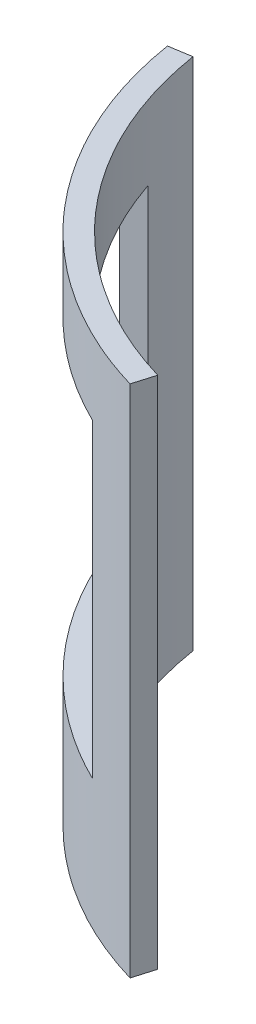
ISO-10303-21;
HEADER;
FILE_DESCRIPTION(('STEP AP214'),'2;1');
FILE_NAME('part.step','',(''),(''),'','','');
FILE_SCHEMA(('AUTOMOTIVE_DESIGN { 1 0 10303 214 1 1 1 1 }'));
ENDSEC;
DATA;
#1=APPLICATION_CONTEXT('core data for automotive mechanical design processes');
#2=APPLICATION_PROTOCOL_DEFINITION('international standard','automotive_design',2000,#1);
#3=PRODUCT_CONTEXT('',#1,'mechanical');
#4=PRODUCT('Part','Part','',(#3));
#5=PRODUCT_RELATED_PRODUCT_CATEGORY('part','',(#4));
#6=PRODUCT_DEFINITION_FORMATION('','',#4);
#7=PRODUCT_DEFINITION_CONTEXT('part definition',#1,'design');
#8=PRODUCT_DEFINITION('design','',#6,#7);
#9=PRODUCT_DEFINITION_SHAPE('','',#8);
#10=(LENGTH_UNIT() NAMED_UNIT(*) SI_UNIT(.MILLI.,.METRE.));
#11=(NAMED_UNIT(*) PLANE_ANGLE_UNIT() SI_UNIT($,.RADIAN.));
#12=(NAMED_UNIT(*) SI_UNIT($,.STERADIAN.) SOLID_ANGLE_UNIT());
#13=UNCERTAINTY_MEASURE_WITH_UNIT(LENGTH_MEASURE(1.E-05),#10,'distance_accuracy_value','');
#14=(GEOMETRIC_REPRESENTATION_CONTEXT(3) GLOBAL_UNCERTAINTY_ASSIGNED_CONTEXT((#13)) GLOBAL_UNIT_ASSIGNED_CONTEXT((#10,
#11,#12)) REPRESENTATION_CONTEXT('',''));
#15=CARTESIAN_POINT('',(0.,0.,0.));
#16=DIRECTION('',(0.,0.,1.));
#17=DIRECTION('',(1.,0.,0.));
#18=AXIS2_PLACEMENT_3D('',#15,#16,#17);
#19=CARTESIAN_POINT('',(553.096762915365,615.,4.56788554436061));
#20=DIRECTION('',(0.,1.,0.));
#21=DIRECTION('',(0.282207935824161,0.,-0.959353261816452));
#22=AXIS2_PLACEMENT_3D('',#19,#20,#21);
#23=CYLINDRICAL_SURFACE('',#22,1045.43211445564);
#24=CARTESIAN_POINT('',(-436.82461185822,1800.,340.698779247339));
#25=CARTESIAN_POINT('',(-436.82461185822,1765.20833333333,340.698779247339));
#26=CARTESIAN_POINT('',(-436.82461185822,1730.41666666667,340.698779247339));
#27=CARTESIAN_POINT('',(-436.82461185822,1660.83333333333,340.698779247339));
#28=CARTESIAN_POINT('',(-436.82461185822,1626.04166666667,340.698779247339));
#29=CARTESIAN_POINT('',(-436.82461185822,1556.45833333333,340.698779247339));
#30=CARTESIAN_POINT('',(-436.82461185822,1521.66666666667,340.698779247339));
#31=CARTESIAN_POINT('',(-436.82461185822,1452.08333333333,340.698779247339));
#32=CARTESIAN_POINT('',(-436.82461185822,1417.29166666667,340.698779247339));
#33=CARTESIAN_POINT('',(-436.82461185822,1347.70833333333,340.698779247339));
#34=CARTESIAN_POINT('',(-436.82461185822,1312.91666666667,340.698779247339));
#35=CARTESIAN_POINT('',(-436.82461185822,1243.33333333333,340.698779247339));
#36=CARTESIAN_POINT('',(-436.82461185822,1208.54166666667,340.698779247339));
#37=CARTESIAN_POINT('',(-436.82461185822,1138.95833333333,340.698779247339));
#38=CARTESIAN_POINT('',(-436.82461185822,1104.16666666667,340.698779247339));
#39=CARTESIAN_POINT('',(-436.82461185822,1034.58333333333,340.698779247339));
#40=CARTESIAN_POINT('',(-436.82461185822,999.791666666667,340.698779247339));
#41=CARTESIAN_POINT('',(-436.82461185822,965.,340.698779247339));
#42=B_SPLINE_CURVE_WITH_KNOTS('',3,(#24,#25,#26,#27,#28,#29,#30,#31,#32,#33,#34,#35,#36,#37,#38,
#39,#40,#41),.UNSPECIFIED.,.F.,.F.,(4,2,2,2,2,2,2,2,4),(0.,104.375000000001,208.750000000001,
313.125000000001,417.5,521.875,626.25,730.625,835.),.UNSPECIFIED.);
#43=CARTESIAN_POINT('',(-436.82461185822,965.,340.698779247339));
#44=VERTEX_POINT('',#43);
#45=CARTESIAN_POINT('',(-436.82461185822,1800.,340.698779247339));
#46=VERTEX_POINT('',#45);
#47=EDGE_CURVE('E85',#44,#46,#42,.F.);
#48=ORIENTED_EDGE('',*,*,#47,.T.);
#49=CARTESIAN_POINT('',(93.6299268974059,1800.,943.619818365348));
#50=CARTESIAN_POINT('',(62.781401560142,1800.,928.52600530013));
#51=CARTESIAN_POINT('',(32.6772898786631,1800.,911.910892751514));
#52=CARTESIAN_POINT('',(-25.7501446155199,1800.,875.799208606985));
#53=CARTESIAN_POINT('',(-54.0733756099959,1800.,856.302693760282));
#54=CARTESIAN_POINT('',(-108.664175220329,1800.,814.617403414278));
#55=CARTESIAN_POINT('',(-134.931658047199,1800.,792.428693423062));
#56=CARTESIAN_POINT('',(-185.15603732809,1800.,745.574338671603));
#57=CARTESIAN_POINT('',(-209.112854854916,1800.,720.90876754259));
#58=CARTESIAN_POINT('',(-254.483403009181,1800.,669.340054222323));
#59=CARTESIAN_POINT('',(-275.89706233718,1800.,642.436993070875));
#60=CARTESIAN_POINT('',(-315.973473374757,1800.,586.654378291058));
#61=CARTESIAN_POINT('',(-334.636162104588,1800.,557.774912324604));
#62=CARTESIAN_POINT('',(-369.029507864856,1800.,498.319747698299));
#63=CARTESIAN_POINT('',(-384.760110846435,1800.,467.744142471745));
#64=CARTESIAN_POINT('',(-413.136615415886,1800.,405.19342047954));
#65=CARTESIAN_POINT('',(-425.782472410316,1800.,373.218402011827));
#66=CARTESIAN_POINT('',(-436.82461185822,1800.,340.698779247339));
#67=B_SPLINE_CURVE_WITH_KNOTS('',3,(#49,#50,#51,#52,#53,#54,#55,#56,#57,#58,#59,#60,#61,#62,#63,
#64,#65,#66),.UNSPECIFIED.,.F.,.F.,(4,2,2,2,2,2,2,2,4),(0.,0.125,0.25,0.375,0.5,0.625,0.75,
0.875,1.),.UNSPECIFIED.);
#68=CARTESIAN_POINT('',(93.6299268974058,1800.,943.619818365348));
#69=VERTEX_POINT('',#68);
#70=EDGE_CURVE('E90',#69,#46,#67,.T.);
#71=ORIENTED_EDGE('',*,*,#70,.F.);
#72=CARTESIAN_POINT('',(93.6299268974058,965.,943.619818365349));
#73=CARTESIAN_POINT('',(93.6299268974058,1243.33333333333,943.619818365349));
#74=CARTESIAN_POINT('',(93.6299268974058,1521.66666666666,943.619818365348));
#75=CARTESIAN_POINT('',(93.6299268974058,1800.,943.619818365348));
#76=B_SPLINE_CURVE_WITH_KNOTS('',3,(#72,#73,#74,#75),.UNSPECIFIED.,.F.,.F.,(4,4),(0.,1.),.UNSPECIFIED.);
#77=CARTESIAN_POINT('',(93.6299268974058,965.,943.619818365349));
#78=VERTEX_POINT('',#77);
#79=EDGE_CURVE('E196',#78,#69,#76,.T.);
#80=ORIENTED_EDGE('',*,*,#79,.F.);
#81=CARTESIAN_POINT('',(-436.82461185822,965.,340.698779247339));
#82=CARTESIAN_POINT('',(-431.303545911072,965.,356.958582469895));
#83=CARTESIAN_POINT('',(-425.381544912086,965.,373.08224685779));
#84=CARTESIAN_POINT('',(-412.75101470491,965.,405.018510191482));
#85=CARTESIAN_POINT('',(-406.042485496719,965.,420.83110913728));
#86=CARTESIAN_POINT('',(-391.854240765601,965.,452.106453814006));
#87=CARTESIAN_POINT('',(-384.374525242673,965.,467.569199544935));
#88=CARTESIAN_POINT('',(-368.662988319765,965.,498.107745954374));
#89=CARTESIAN_POINT('',(-360.431166919785,965.,513.183546632884));
#90=CARTESIAN_POINT('',(-343.234503049659,965.,542.91111339002));
#91=CARTESIAN_POINT('',(-334.269660579515,965.,557.562879468646));
#92=CARTESIAN_POINT('',(-315.629591740167,965.,586.407342416206));
#93=CARTESIAN_POINT('',(-305.954365370964,965.,600.600039285141));
#94=CARTESIAN_POINT('',(-285.916170340973,965.,628.491332076792));
#95=CARTESIAN_POINT('',(-275.553201680185,965.,642.18992799951));
#96=CARTESIAN_POINT('',(-254.165496526591,965.,669.060381611245));
#97=CARTESIAN_POINT('',(-243.140760033785,965.,682.232239300263));
#98=CARTESIAN_POINT('',(-220.455497830313,965.,708.01658246465));
#99=CARTESIAN_POINT('',(-208.794972119646,965.,720.62906794002));
#100=CARTESIAN_POINT('',(-184.867191172532,965.,745.264743453072));
#101=CARTESIAN_POINT('',(-172.599935936084,965.,757.287933490754));
#102=CARTESIAN_POINT('',(-147.487759439204,965.,780.715098603912));
#103=CARTESIAN_POINT('',(-134.642838178771,965.,792.119073679387));
#104=CARTESIAN_POINT('',(-108.407192547577,965.,814.280890107271));
#105=CARTESIAN_POINT('',(-95.0164681768163,965.,825.038731459679));
#106=CARTESIAN_POINT('',(-67.7210826535087,965.,845.88136571488));
#107=CARTESIAN_POINT('',(-53.8164215009616,965.,855.966158617672));
#108=CARTESIAN_POINT('',(-25.5275193640728,965.,875.43904297441));
#109=CARTESIAN_POINT('',(-11.1432783797311,965.,884.827134428357));
#110=CARTESIAN_POINT('',(18.0704236428746,965.,902.882966930143));
#111=CARTESIAN_POINT('',(32.8998846811387,965.,911.550707977982));
#112=CARTESIAN_POINT('',(62.9675087802098,965.,928.1456828219));
#113=CARTESIAN_POINT('',(78.2056718410169,965.,936.072916617979));
#114=CARTESIAN_POINT('',(93.6299268974058,965.,943.619818365349));
#115=B_SPLINE_CURVE_WITH_KNOTS('',3,(#81,#82,#83,#84,#85,#86,#87,#88,#89,#90,#91,#92,#93,#94,
#95,#96,#97,#98,#99,#100,#101,#102,#103,#104,#105,#106,#107,#108,#109,#110,#111,#112,#113,#114),
.UNSPECIFIED.,.F.,.F.,(4,2,2,2,2,2,2,2,2,2,2,2,2,2,2,2,4),(0.,51.5095671682497,103.019134336499,
154.528701504749,206.038268672998,257.547835841248,309.057403009497,360.566970177746,
412.076537345996,463.586104514246,515.095671682495,566.605238850745,618.114806018994,
669.624373187244,721.133940355494,772.643507523743,824.153074691993),.UNSPECIFIED.);
#116=EDGE_CURVE('E94',#78,#44,#115,.F.);
#117=ORIENTED_EDGE('',*,*,#116,.T.);
#118=EDGE_LOOP('',(#48,#71,#80,#117));
#119=FACE_BOUND('',#118,.T.);
#120=CARTESIAN_POINT('',(-479.248937515269,2000.,169.4637943401));
#121=CARTESIAN_POINT('',(-466.867341767577,2000.,246.979890572863));
#122=CARTESIAN_POINT('',(-424.569290257625,2000.,399.20781914811));
#123=CARTESIAN_POINT('',(-311.721678513977,2000.,607.610713281618));
#124=CARTESIAN_POINT('',(-155.175851061505,2000.,785.542592568856));
#125=CARTESIAN_POINT('',(37.1581233401244,2000.,924.01277726701));
#126=CARTESIAN_POINT('',(182.759520484231,2000.,985.353632734906));
#127=CARTESIAN_POINT('',(258.06752385055,2000.,1007.50659455505));
#128=B_SPLINE_CURVE_WITH_KNOTS('',3,(#120,#121,#122,#123,#124,#125,#126,#127),.UNSPECIFIED.,.F.,
.F.,(4,1,1,1,1,4),(0.,0.2,0.4,0.6,0.8,1.),.UNSPECIFIED.);
#129=CARTESIAN_POINT('',(258.067523850551,2000.,1007.50659455505));
#130=VERTEX_POINT('',#129);
#131=CARTESIAN_POINT('',(-479.248937515269,2000.,169.4637943401));
#132=VERTEX_POINT('',#131);
#133=EDGE_CURVE('E172',#130,#132,#128,.F.);
#134=ORIENTED_EDGE('',*,*,#133,.T.);
#135=DIRECTION('',(0.,1.,0.));
#136=VECTOR('',#135,1.);
#137=CARTESIAN_POINT('',(-479.248937515268,615.,169.4637943401));
#138=LINE('',#137,#136);
#139=CARTESIAN_POINT('',(-479.248937515269,615.,169.4637943401));
#140=VERTEX_POINT('',#139);
#141=EDGE_CURVE('E301',#140,#132,#138,.T.);
#142=ORIENTED_EDGE('',*,*,#141,.F.);
#143=CARTESIAN_POINT('',(258.06752385055,615.,1007.50659455505));
#144=CARTESIAN_POINT('',(239.240416297117,615.,1001.96831694608));
#145=CARTESIAN_POINT('',(220.570149039359,615.,995.897742359258));
#146=CARTESIAN_POINT('',(183.600443487328,615.,982.716113297761));
#147=CARTESIAN_POINT('',(165.301007352546,615.,975.60505276592));
#148=CARTESIAN_POINT('',(129.130413719413,615.,960.366664950826));
#149=CARTESIAN_POINT('',(111.259254309054,615.,952.239342205599));
#150=CARTESIAN_POINT('',(76.0024834277765,615.,934.992527460713));
#151=CARTESIAN_POINT('',(58.6168647894712,615.,925.873050116641));
#152=CARTESIAN_POINT('',(24.3887349334192,615.,906.666192286761));
#153=CARTESIAN_POINT('',(7.54622437352004,615.,896.578810628624));
#154=CARTESIAN_POINT('',(-25.5449836048444,615.,875.472682692327));
#155=CARTESIAN_POINT('',(-41.7936722313233,615.,864.453922632395));
#156=CARTESIAN_POINT('',(-73.6467247799488,615.,841.521412430678));
#157=CARTESIAN_POINT('',(-89.2510881437536,615.,829.607661513362));
#158=CARTESIAN_POINT('',(-119.764948053652,615.,804.921502797216));
#159=CARTESIAN_POINT('',(-134.674453664674,615.,792.14910620536));
#160=CARTESIAN_POINT('',(-163.747867135971,615.,765.782179834505));
#161=CARTESIAN_POINT('',(-177.911774945262,615.,752.187649999287));
#162=CARTESIAN_POINT('',(-205.452723369076,615.,724.223403136446));
#163=CARTESIAN_POINT('',(-218.829753380998,615.,709.853675668601));
#164=CARTESIAN_POINT('',(-244.755844417068,615.,680.385767288733));
#165=CARTESIAN_POINT('',(-257.304905441217,615.,665.28758637671));
#166=CARTESIAN_POINT('',(-281.533916482158,615.,634.409471689004));
#167=CARTESIAN_POINT('',(-293.213878204467,615.,618.629547099955));
#168=CARTESIAN_POINT('',(-315.663406152996,615.,586.434875615261));
#169=CARTESIAN_POINT('',(-326.432972441468,615.,570.020128763027));
#170=CARTESIAN_POINT('',(-347.031968826863,615.,536.610797331911));
#171=CARTESIAN_POINT('',(-356.861386653591,615.,519.6162051892));
#172=CARTESIAN_POINT('',(-375.550459429504,615.,485.101924962111));
#173=CARTESIAN_POINT('',(-384.410115219013,615.,467.58223733276));
#174=CARTESIAN_POINT('',(-401.129990665627,615.,432.072485897691));
#175=CARTESIAN_POINT('',(-408.990225111998,615.,414.082429057166));
#176=CARTESIAN_POINT('',(-423.681501679842,615.,377.686898370733));
#177=CARTESIAN_POINT('',(-430.51254504788,615.,359.281425028012));
#178=CARTESIAN_POINT('',(-443.128734918942,615.,322.115254052829));
#179=CARTESIAN_POINT('',(-448.913865972905,615.,303.354551177829));
#180=CARTESIAN_POINT('',(-459.421602162057,615.,265.537785224674));
#181=CARTESIAN_POINT('',(-464.144202552665,615.,246.481720828029));
#182=CARTESIAN_POINT('',(-472.510155988913,615.,208.134292016943));
#183=CARTESIAN_POINT('',(-476.153515317422,615.,188.842928972988));
#184=CARTESIAN_POINT('',(-479.248937515269,615.,169.4637943401));
#185=B_SPLINE_CURVE_WITH_KNOTS('',3,(#143,#144,#145,#146,#147,#148,#149,#150,#151,#152,#153,
#154,#155,#156,#157,#158,#159,#160,#161,#162,#163,#164,#165,#166,#167,#168,#169,#170,#171,#172,
#173,#174,#175,#176,#177,#178,#179,#180,#181,#182,#183,#184),.UNSPECIFIED.,.F.,.F.,(4,2,2,2,2,2,
2,2,2,2,2,2,2,2,2,2,2,2,2,2,4),(0.,58.8662123110268,117.732767324086,176.599059483282,
235.464482218568,294.329976252775,353.196341482705,412.062757722372,470.928405791382,
529.794057885627,588.660502969722,647.526948053817,706.392600148063,765.258248217073,
824.124664456739,882.991029686669,941.856523720876,1000.72194645616,1059.58823861536,
1118.45479362842,1177.32100593944),.UNSPECIFIED.);
#186=CARTESIAN_POINT('',(258.067523850551,615.,1007.50659455505));
#187=VERTEX_POINT('',#186);
#188=EDGE_CURVE('E310',#187,#140,#185,.T.);
#189=ORIENTED_EDGE('',*,*,#188,.F.);
#190=DIRECTION('',(0.,1.,0.));
#191=VECTOR('',#190,1.);
#192=CARTESIAN_POINT('',(258.067523850551,615.,1007.50659455505));
#193=LINE('',#192,#191);
#194=EDGE_CURVE('E279',#187,#130,#193,.T.);
#195=ORIENTED_EDGE('',*,*,#194,.T.);
#196=EDGE_LOOP('',(#134,#142,#189,#195));
#197=FACE_BOUND('',#196,.T.);
#198=ADVANCED_FACE('F18',(#119,#197),#23,.T.);
#199=CARTESIAN_POINT('',(-436.82461185822,965.,340.698779247339));
#200=CARTESIAN_POINT('',(-380.010513969767,965.,321.407374914806));
#201=CARTESIAN_POINT('',(-436.82461185822,1243.33333333333,340.698779247339));
#202=CARTESIAN_POINT('',(-380.010513969767,1243.33333333333,321.407374914806));
#203=CARTESIAN_POINT('',(-436.82461185822,1521.66666666666,340.698779247339));
#204=CARTESIAN_POINT('',(-380.010513969767,1521.66666666666,321.407374914806));
#205=CARTESIAN_POINT('',(-436.82461185822,1800.,340.698779247339));
#206=CARTESIAN_POINT('',(-380.010513969767,1800.,321.407374914806));
#207=B_SPLINE_SURFACE_WITH_KNOTS('',3,1,((#199,#200),(#201,#202),(#203,#204),(#205,#206)),
.UNSPECIFIED.,.F.,.F.,.F.,(4,4),(2,2),(0.,1.),(0.,1.),.UNSPECIFIED.);
#208=CARTESIAN_POINT('',(-436.82461185822,965.,340.698779247339));
#209=CARTESIAN_POINT('',(-380.010513969767,965.,321.407374914807));
#210=B_SPLINE_CURVE_WITH_KNOTS('',1,(#208,#209),.UNSPECIFIED.,.F.,.F.,(2,2),(0.,1.),.UNSPECIFIED.);
#211=CARTESIAN_POINT('',(-380.010513969767,965.,321.407374914807));
#212=VERTEX_POINT('',#211);
#213=EDGE_CURVE('E98',#44,#212,#210,.T.);
#214=CARTESIAN_POINT('',(-380.010513969767,965.,321.407374914806));
#215=CARTESIAN_POINT('',(-380.010513969767,1243.33333333333,321.407374914806));
#216=CARTESIAN_POINT('',(-380.010513969767,1521.66666666666,321.407374914806));
#217=CARTESIAN_POINT('',(-380.010513969767,1800.,321.407374914806));
#218=B_SPLINE_CURVE_WITH_KNOTS('',3,(#214,#215,#216,#217),.UNSPECIFIED.,.F.,.F.,(4,4),(0.,1.),.UNSPECIFIED.);
#219=CARTESIAN_POINT('',(-380.010513969767,1800.,321.407374914806));
#220=VERTEX_POINT('',#219);
#221=EDGE_CURVE('E104',#212,#220,#218,.T.);
#222=CARTESIAN_POINT('',(-380.010513969767,1800.,321.407374914806));
#223=CARTESIAN_POINT('',(-436.82461185822,1800.,340.698779247339));
#224=B_SPLINE_CURVE_WITH_KNOTS('',1,(#222,#223),.UNSPECIFIED.,.F.,.F.,(2,2),(0.,1.),.UNSPECIFIED.);
#225=EDGE_CURVE('E101',#46,#220,#224,.F.);
#226=ORIENTED_EDGE('',*,*,#47,.F.);
#227=ORIENTED_EDGE('',*,*,#213,.T.);
#228=ORIENTED_EDGE('',*,*,#221,.T.);
#229=ORIENTED_EDGE('',*,*,#225,.F.);
#230=EDGE_LOOP('',(#226,#227,#228,#229));
#231=FACE_BOUND('',#230,.T.);
#232=ADVANCED_FACE('F102',(#231),#207,.F.);
#233=CARTESIAN_POINT('',(93.6299268974058,965.,943.619818365349));
#234=CARTESIAN_POINT('',(119.999893708146,965.,889.725246742592));
#235=CARTESIAN_POINT('',(62.781401560142,965.,928.52600530013));
#236=CARTESIAN_POINT('',(90.921843464045,965.,875.497705883278));
#237=CARTESIAN_POINT('',(32.6772898786634,965.,911.910892751514));
#238=CARTESIAN_POINT('',(62.5454830883785,965.,859.83617677555));
#239=CARTESIAN_POINT('',(-25.7501446155197,965.,875.799208606985));
#240=CARTESIAN_POINT('',(7.47134721701072,965.,825.797033754171));
#241=CARTESIAN_POINT('',(-54.0733756099959,965.,856.302693760282));
#242=CARTESIAN_POINT('',(-19.2263417301433,965.,807.419473332751));
#243=CARTESIAN_POINT('',(-108.664175220329,965.,814.617403414277));
#244=CARTESIAN_POINT('',(-70.6840369223811,965.,768.126607503055));
#245=CARTESIAN_POINT('',(-134.931658047199,965.,792.428693423062));
#246=CARTESIAN_POINT('',(-95.4439623021245,965.,747.211363843191));
#247=CARTESIAN_POINT('',(-185.156037328089,965.,745.574338671604));
#248=CARTESIAN_POINT('',(-142.785837099764,965.,703.046099321711));
#249=CARTESIAN_POINT('',(-209.112854854916,965.,720.90876754259));
#250=CARTESIAN_POINT('',(-165.367712120297,965.,679.79614786544));
#251=CARTESIAN_POINT('',(-254.483403009181,965.,669.340054222323));
#252=CARTESIAN_POINT('',(-208.134329467756,965.,631.187093767835));
#253=CARTESIAN_POINT('',(-275.89706233718,965.,642.436993070875));
#254=CARTESIAN_POINT('',(-228.319004587297,965.,605.828067515227));
#255=CARTESIAN_POINT('',(-315.973473374757,965.,586.654378291058));
#256=CARTESIAN_POINT('',(-266.095328771787,965.,553.246958448224));
#257=CARTESIAN_POINT('',(-334.636162104588,965.,557.774912324605));
#258=CARTESIAN_POINT('',(-283.686918471556,965.,526.024958264605));
#259=CARTESIAN_POINT('',(-369.029507864855,965.,498.3197476983));
#260=CARTESIAN_POINT('',(-316.106342905816,965.,469.982076299462));
#261=CARTESIAN_POINT('',(-384.760110846435,965.,467.744142471746));
#262=CARTESIAN_POINT('',(-330.934126693453,965.,441.161282588861));
#263=CARTESIAN_POINT('',(-413.136615415886,965.,405.19342047954));
#264=CARTESIAN_POINT('',(-357.682031710025,965.,382.200505144595));
#265=CARTESIAN_POINT('',(-425.782472410316,965.,373.218402011828));
#266=CARTESIAN_POINT('',(-369.60211090485,965.,352.060614067304));
#267=CARTESIAN_POINT('',(-436.82461185822,965.,340.698779247339));
#268=CARTESIAN_POINT('',(-380.010513969767,965.,321.407374914807));
#269=B_SPLINE_SURFACE_WITH_KNOTS('',3,1,((#233,#234),(#235,#236),(#237,#238),(#239,#240),(#241,
#242),(#243,#244),(#245,#246),(#247,#248),(#249,#250),(#251,#252),(#253,#254),(#255,#256),(#257,
#258),(#259,#260),(#261,#262),(#263,#264),(#265,#266),(#267,#268)),.UNSPECIFIED.,.F.,.F.,.F.,(4,
2,2,2,2,2,2,2,4),(2,2),(0.,0.125,0.25,0.375,0.5,0.625,0.75,0.875,1.),(0.,1.),.UNSPECIFIED.);
#270=CARTESIAN_POINT('',(119.999893708146,965.,889.725246742592));
#271=CARTESIAN_POINT('',(93.6299268974058,965.,943.619818365349));
#272=B_SPLINE_CURVE_WITH_KNOTS('',1,(#270,#271),.UNSPECIFIED.,.F.,.F.,(2,2),(0.,1.),.UNSPECIFIED.);
#273=CARTESIAN_POINT('',(119.999893708146,965.,889.725246742592));
#274=VERTEX_POINT('',#273);
#275=EDGE_CURVE('E109',#274,#78,#272,.T.);
#276=CARTESIAN_POINT('',(119.999893708146,965.,889.725246742592));
#277=CARTESIAN_POINT('',(90.921843464045,965.,875.497705883278));
#278=CARTESIAN_POINT('',(62.5454830883785,965.,859.83617677555));
#279=CARTESIAN_POINT('',(7.47134721701072,965.,825.797033754171));
#280=CARTESIAN_POINT('',(-19.2263417301433,965.,807.419473332751));
#281=CARTESIAN_POINT('',(-70.6840369223811,965.,768.126607503055));
#282=CARTESIAN_POINT('',(-95.4439623021245,965.,747.211363843191));
#283=CARTESIAN_POINT('',(-142.785837099764,965.,703.046099321711));
#284=CARTESIAN_POINT('',(-165.367712120297,965.,679.79614786544));
#285=CARTESIAN_POINT('',(-208.134329467756,965.,631.187093767835));
#286=CARTESIAN_POINT('',(-228.319004587297,965.,605.828067515227));
#287=CARTESIAN_POINT('',(-266.095328771787,965.,553.246958448224));
#288=CARTESIAN_POINT('',(-283.686918471556,965.,526.024958264605));
#289=CARTESIAN_POINT('',(-316.106342905816,965.,469.982076299462));
#290=CARTESIAN_POINT('',(-330.934126693453,965.,441.161282588861));
#291=CARTESIAN_POINT('',(-357.682031710025,965.,382.200505144595));
#292=CARTESIAN_POINT('',(-369.60211090485,965.,352.060614067304));
#293=CARTESIAN_POINT('',(-380.010513969767,965.,321.407374914807));
#294=B_SPLINE_CURVE_WITH_KNOTS('',3,(#276,#277,#278,#279,#280,#281,#282,#283,#284,#285,#286,
#287,#288,#289,#290,#291,#292,#293),.UNSPECIFIED.,.F.,.F.,(4,2,2,2,2,2,2,2,4),(0.,0.125,0.25,
0.375,0.5,0.625,0.75,0.875,1.),.UNSPECIFIED.);
#295=EDGE_CURVE('E207',#274,#212,#294,.T.);
#296=ORIENTED_EDGE('',*,*,#116,.F.);
#297=ORIENTED_EDGE('',*,*,#275,.F.);
#298=ORIENTED_EDGE('',*,*,#295,.T.);
#299=ORIENTED_EDGE('',*,*,#213,.F.);
#300=EDGE_LOOP('',(#296,#297,#298,#299));
#301=FACE_BOUND('',#300,.T.);
#302=ADVANCED_FACE('F212',(#301),#269,.F.);
#303=CARTESIAN_POINT('',(119.999893708146,1800.,889.725246742592));
#304=CARTESIAN_POINT('',(93.6299268974058,1800.,943.619818365348));
#305=CARTESIAN_POINT('',(119.999893708146,1521.66666666666,889.725246742592));
#306=CARTESIAN_POINT('',(93.6299268974058,1521.66666666666,943.619818365348));
#307=CARTESIAN_POINT('',(119.999893708146,1243.33333333333,889.725246742592));
#308=CARTESIAN_POINT('',(93.6299268974058,1243.33333333333,943.619818365349));
#309=CARTESIAN_POINT('',(119.999893708146,965.,889.725246742592));
#310=CARTESIAN_POINT('',(93.6299268974058,965.,943.619818365349));
#311=B_SPLINE_SURFACE_WITH_KNOTS('',3,1,((#303,#304),(#305,#306),(#307,#308),(#309,#310)),
.UNSPECIFIED.,.F.,.F.,.F.,(4,4),(2,2),(0.,1.),(0.,1.),.UNSPECIFIED.);
#312=CARTESIAN_POINT('',(119.999893708146,1800.,889.725246742592));
#313=CARTESIAN_POINT('',(119.999893708146,1765.20833333333,889.725246742592));
#314=CARTESIAN_POINT('',(119.999893708146,1730.41666666667,889.725246742592));
#315=CARTESIAN_POINT('',(119.999893708146,1660.83333333333,889.725246742592));
#316=CARTESIAN_POINT('',(119.999893708146,1626.04166666667,889.725246742592));
#317=CARTESIAN_POINT('',(119.999893708146,1556.45833333333,889.725246742592));
#318=CARTESIAN_POINT('',(119.999893708146,1521.66666666667,889.725246742592));
#319=CARTESIAN_POINT('',(119.999893708146,1452.08333333333,889.725246742592));
#320=CARTESIAN_POINT('',(119.999893708146,1417.29166666667,889.725246742592));
#321=CARTESIAN_POINT('',(119.999893708146,1347.70833333333,889.725246742592));
#322=CARTESIAN_POINT('',(119.999893708146,1312.91666666667,889.725246742592));
#323=CARTESIAN_POINT('',(119.999893708146,1243.33333333333,889.725246742592));
#324=CARTESIAN_POINT('',(119.999893708146,1208.54166666667,889.725246742592));
#325=CARTESIAN_POINT('',(119.999893708146,1138.95833333333,889.725246742592));
#326=CARTESIAN_POINT('',(119.999893708146,1104.16666666667,889.725246742592));
#327=CARTESIAN_POINT('',(119.999893708146,1034.58333333333,889.725246742592));
#328=CARTESIAN_POINT('',(119.999893708146,999.791666666667,889.725246742592));
#329=CARTESIAN_POINT('',(119.999893708146,965.,889.725246742592));
#330=B_SPLINE_CURVE_WITH_KNOTS('',3,(#312,#313,#314,#315,#316,#317,#318,#319,#320,#321,#322,
#323,#324,#325,#326,#327,#328,#329),.UNSPECIFIED.,.F.,.F.,(4,2,2,2,2,2,2,2,4),(0.,
104.375000000001,208.750000000001,313.125000000001,417.5,521.875,626.25,730.625,835.),.UNSPECIFIED.);
#331=CARTESIAN_POINT('',(119.999893708146,1800.,889.725246742592));
#332=VERTEX_POINT('',#331);
#333=EDGE_CURVE('E185',#332,#274,#330,.T.);
#334=CARTESIAN_POINT('',(119.999893708146,1800.,889.725246742592));
#335=CARTESIAN_POINT('',(93.6299268974059,1800.,943.619818365348));
#336=B_SPLINE_CURVE_WITH_KNOTS('',1,(#334,#335),.UNSPECIFIED.,.F.,.F.,(2,2),(0.,1.),.UNSPECIFIED.);
#337=EDGE_CURVE('E114',#332,#69,#336,.T.);
#338=ORIENTED_EDGE('',*,*,#333,.T.);
#339=ORIENTED_EDGE('',*,*,#275,.T.);
#340=ORIENTED_EDGE('',*,*,#79,.T.);
#341=ORIENTED_EDGE('',*,*,#337,.F.);
#342=EDGE_LOOP('',(#338,#339,#340,#341));
#343=FACE_BOUND('',#342,.T.);
#344=ADVANCED_FACE('F138',(#343),#311,.T.);
#345=CARTESIAN_POINT('',(-380.010513969767,1800.,321.407374914806));
#346=CARTESIAN_POINT('',(-436.82461185822,1800.,340.698779247339));
#347=CARTESIAN_POINT('',(-369.60211090485,1800.,352.060614067303));
#348=CARTESIAN_POINT('',(-425.782472410316,1800.,373.218402011827));
#349=CARTESIAN_POINT('',(-357.682031710025,1800.,382.200505144595));
#350=CARTESIAN_POINT('',(-413.136615415886,1800.,405.19342047954));
#351=CARTESIAN_POINT('',(-330.934126693453,1800.,441.16128258886));
#352=CARTESIAN_POINT('',(-384.760110846435,1800.,467.744142471745));
#353=CARTESIAN_POINT('',(-316.106342905816,1800.,469.982076299461));
#354=CARTESIAN_POINT('',(-369.029507864856,1800.,498.319747698299));
#355=CARTESIAN_POINT('',(-283.686918471556,1800.,526.024958264605));
#356=CARTESIAN_POINT('',(-334.636162104588,1800.,557.774912324604));
#357=CARTESIAN_POINT('',(-266.095328771787,1800.,553.246958448223));
#358=CARTESIAN_POINT('',(-315.973473374757,1800.,586.654378291058));
#359=CARTESIAN_POINT('',(-228.319004587297,1800.,605.828067515226));
#360=CARTESIAN_POINT('',(-275.89706233718,1800.,642.436993070875));
#361=CARTESIAN_POINT('',(-208.134329467756,1800.,631.187093767835));
#362=CARTESIAN_POINT('',(-254.483403009181,1800.,669.340054222323));
#363=CARTESIAN_POINT('',(-165.367712120298,1800.,679.79614786544));
#364=CARTESIAN_POINT('',(-209.112854854916,1800.,720.90876754259));
#365=CARTESIAN_POINT('',(-142.785837099764,1800.,703.04609932171));
#366=CARTESIAN_POINT('',(-185.15603732809,1800.,745.574338671603));
#367=CARTESIAN_POINT('',(-95.4439623021249,1800.,747.211363843191));
#368=CARTESIAN_POINT('',(-134.931658047199,1800.,792.428693423062));
#369=CARTESIAN_POINT('',(-70.6840369223811,1800.,768.126607503055));
#370=CARTESIAN_POINT('',(-108.664175220329,1800.,814.617403414278));
#371=CARTESIAN_POINT('',(-19.2263417301433,1800.,807.419473332751));
#372=CARTESIAN_POINT('',(-54.0733756099959,1800.,856.302693760282));
#373=CARTESIAN_POINT('',(7.47134721701053,1800.,825.797033754171));
#374=CARTESIAN_POINT('',(-25.7501446155199,1800.,875.799208606985));
#375=CARTESIAN_POINT('',(62.5454830883782,1800.,859.83617677555));
#376=CARTESIAN_POINT('',(32.6772898786631,1800.,911.910892751514));
#377=CARTESIAN_POINT('',(90.9218434640449,1800.,875.497705883278));
#378=CARTESIAN_POINT('',(62.781401560142,1800.,928.52600530013));
#379=CARTESIAN_POINT('',(119.999893708146,1800.,889.725246742592));
#380=CARTESIAN_POINT('',(93.6299268974059,1800.,943.619818365348));
#381=B_SPLINE_SURFACE_WITH_KNOTS('',3,1,((#345,#346),(#347,#348),(#349,#350),(#351,#352),(#353,
#354),(#355,#356),(#357,#358),(#359,#360),(#361,#362),(#363,#364),(#365,#366),(#367,#368),(#369,
#370),(#371,#372),(#373,#374),(#375,#376),(#377,#378),(#379,#380)),.UNSPECIFIED.,.F.,.F.,.F.,(4,
2,2,2,2,2,2,2,4),(2,2),(0.,0.125,0.25,0.375,0.5,0.625,0.75,0.875,1.),(0.,1.),.UNSPECIFIED.);
#382=CARTESIAN_POINT('',(-380.010513969767,1800.,321.407374914806));
#383=CARTESIAN_POINT('',(-374.806315997352,1800.,336.733986799671));
#384=CARTESIAN_POINT('',(-369.224193652395,1800.,351.93227320281));
#385=CARTESIAN_POINT('',(-357.318561601638,1800.,382.035633401496));
#386=CARTESIAN_POINT('',(-350.995051895839,1800.,396.940707197044));
#387=CARTESIAN_POINT('',(-337.621106507639,1800.,426.42108053641));
#388=CARTESIAN_POINT('',(-330.570670825239,1800.,440.996380080229));
#389=CARTESIAN_POINT('',(-315.76085884682,1800.,469.782241873202));
#390=CARTESIAN_POINT('',(-308.001482550801,1800.,483.992804122356));
#391=CARTESIAN_POINT('',(-291.791778826571,1800.,512.01423044171));
#392=CARTESIAN_POINT('',(-283.341451398361,1800.,525.825094511911));
#393=CARTESIAN_POINT('',(-265.771183376203,1800.,553.014100588649));
#394=CARTESIAN_POINT('',(-256.651242782255,1800.,566.392242595187));
#395=CARTESIAN_POINT('',(-237.763090576829,1800.,592.682783368263));
#396=CARTESIAN_POINT('',(-227.99487896535,1800.,605.595182134801));
#397=CARTESIAN_POINT('',(-207.834668444331,1800.,630.923472277085));
#398=CARTESIAN_POINT('',(-197.442669534791,1800.,643.339363652831));
#399=CARTESIAN_POINT('',(-176.059372053262,1800.,667.643877980443));
#400=CARTESIAN_POINT('',(-165.068073481274,1800.,679.532500932309));
#401=CARTESIAN_POINT('',(-142.513568557515,1800.,702.754272557826));
#402=CARTESIAN_POINT('',(-130.950362205743,1800.,714.087421231476));
#403=CARTESIAN_POINT('',(-107.279437196146,1800.,736.170041933425));
#404=CARTESIAN_POINT('',(-95.17171853832,1800.,746.919513961723));
#405=CARTESIAN_POINT('',(-70.4418031368612,1800.,767.80940754805));
#406=CARTESIAN_POINT('',(-57.8196063932283,1800.,777.94982910608));
#407=CARTESIAN_POINT('',(-32.0907722592962,1800.,797.596251729726));
#408=CARTESIAN_POINT('',(-18.9841348689972,1800.,807.102252795343));
#409=CARTESIAN_POINT('',(7.68119544075567,1800.,825.457538940539));
#410=CARTESIAN_POINT('',(21.2398883602094,1800.,834.306824020118));
#411=CARTESIAN_POINT('',(48.7769419451793,1800.,851.326386509603));
#412=CARTESIAN_POINT('',(62.7553026106954,1800.,859.496663919508));
#413=CARTESIAN_POINT('',(91.0972695188321,1800.,875.139211076476));
#414=CARTESIAN_POINT('',(105.460875761453,1800.,882.611480823537));
#415=CARTESIAN_POINT('',(119.999893708146,1800.,889.725246742592));
#416=B_SPLINE_CURVE_WITH_KNOTS('',3,(#382,#383,#384,#385,#386,#387,#388,#389,#390,#391,#392,
#393,#394,#395,#396,#397,#398,#399,#400,#401,#402,#403,#404,#405,#406,#407,#408,#409,#410,#411,
#412,#413,#414,#415),.UNSPECIFIED.,.F.,.F.,(4,2,2,2,2,2,2,2,2,2,2,2,2,2,2,2,4),(0.,
48.5533024932311,97.1066049864622,145.659907479693,194.213209972925,242.766512466156,
291.319814959387,339.873117452618,388.42641994585,436.979722439081,485.533024932312,
534.086327425543,582.639629918775,631.192932412006,679.746234905237,728.299537398468,
776.852839891699),.UNSPECIFIED.);
#417=EDGE_CURVE('E386',#220,#332,#416,.T.);
#418=ORIENTED_EDGE('',*,*,#417,.T.);
#419=ORIENTED_EDGE('',*,*,#337,.T.);
#420=ORIENTED_EDGE('',*,*,#70,.T.);
#421=ORIENTED_EDGE('',*,*,#225,.T.);
#422=EDGE_LOOP('',(#418,#419,#420,#421));
#423=FACE_BOUND('',#422,.T.);
#424=ADVANCED_FACE('F113',(#423),#381,.T.);
#425=CARTESIAN_POINT('',(258.06752385055,2000.,1007.50659455505));
#426=CARTESIAN_POINT('',(275.,2000.,949.94539884606));
#427=CARTESIAN_POINT('',(182.759520484231,2000.,985.353632734906));
#428=CARTESIAN_POINT('',(204.01411390892,2000.,929.063851679084));
#429=CARTESIAN_POINT('',(37.1581233401243,2000.,924.01277726701));
#430=CARTESIAN_POINT('',(66.7691501552263,2000.,871.243503451383));
#431=CARTESIAN_POINT('',(-155.175851061505,2000.,785.542592568856));
#432=CARTESIAN_POINT('',(-114.526289745187,2000.,740.720473778418));
#433=CARTESIAN_POINT('',(-311.721678513977,2000.,607.610713281618));
#434=CARTESIAN_POINT('',(-262.087555199543,2000.,573.000556233711));
#435=CARTESIAN_POINT('',(-424.569290257625,2000.,399.20781914811));
#436=CARTESIAN_POINT('',(-368.458556352226,2000.,376.558432651547));
#437=CARTESIAN_POINT('',(-466.867341767577,2000.,246.979890572863));
#438=CARTESIAN_POINT('',(-408.329015428863,2000.,233.067250908752));
#439=CARTESIAN_POINT('',(-479.248937515269,2000.,169.4637943401));
#440=CARTESIAN_POINT('',(-420.,2000.,160.));
#441=B_SPLINE_SURFACE_WITH_KNOTS('',3,1,((#425,#426),(#427,#428),(#429,#430),(#431,#432),(#433,
#434),(#435,#436),(#437,#438),(#439,#440)),.UNSPECIFIED.,.F.,.F.,.F.,(4,1,1,1,1,4),(2,2),(0.,
0.2,0.4,0.6,0.8,1.),(0.,1.),.UNSPECIFIED.);
#442=DIRECTION('',(0.282207935824164,0.,-0.959353261816451));
#443=VECTOR('',#442,1.);
#444=CARTESIAN_POINT('',(258.067523850551,2000.,1007.50659455505));
#445=LINE('',#444,#443);
#446=CARTESIAN_POINT('',(275.,2000.,949.94539884606));
#447=VERTEX_POINT('',#446);
#448=EDGE_CURVE('E286',#130,#447,#445,.T.);
#449=CARTESIAN_POINT('',(275.,2000.,949.94539884606));
#450=CARTESIAN_POINT('',(204.01411390892,2000.,929.063851679084));
#451=CARTESIAN_POINT('',(66.7691501552263,2000.,871.243503451383));
#452=CARTESIAN_POINT('',(-114.526289745187,2000.,740.720473778418));
#453=CARTESIAN_POINT('',(-262.087555199543,2000.,573.000556233711));
#454=CARTESIAN_POINT('',(-368.458556352226,2000.,376.558432651547));
#455=CARTESIAN_POINT('',(-408.329015428863,2000.,233.067250908752));
#456=CARTESIAN_POINT('',(-420.,2000.,160.));
#457=B_SPLINE_CURVE_WITH_KNOTS('',3,(#449,#450,#451,#452,#453,#454,#455,#456),.UNSPECIFIED.,.F.,
.F.,(4,1,1,1,1,4),(0.,0.2,0.4,0.6,0.8,1.),.UNSPECIFIED.);
#458=CARTESIAN_POINT('',(-420.,2000.,160.));
#459=VERTEX_POINT('',#458);
#460=EDGE_CURVE('E40',#447,#459,#457,.T.);
#461=DIRECTION('',(0.987482291921154,0.,-0.157729905668341));
#462=VECTOR('',#461,1.);
#463=CARTESIAN_POINT('',(-479.248937515268,2000.,169.4637943401));
#464=LINE('',#463,#462);
#465=EDGE_CURVE('E303',#132,#459,#464,.T.);
#466=ORIENTED_EDGE('',*,*,#133,.F.);
#467=ORIENTED_EDGE('',*,*,#448,.T.);
#468=ORIENTED_EDGE('',*,*,#460,.T.);
#469=ORIENTED_EDGE('',*,*,#465,.F.);
#470=EDGE_LOOP('',(#466,#467,#468,#469));
#471=FACE_BOUND('',#470,.T.);
#472=ADVANCED_FACE('F137',(#471),#441,.F.);
#473=CARTESIAN_POINT('',(258.067523850551,2000.,1007.50659455505));
#474=DIRECTION('',(-0.959353261816451,0.,-0.282207935824164));
#475=DIRECTION('',(-0.282207935824164,0.,0.959353261816451));
#476=AXIS2_PLACEMENT_3D('',#473,#474,#475);
#477=PLANE('',#476);
#478=ORIENTED_EDGE('',*,*,#194,.F.);
#479=CARTESIAN_POINT('',(258.06752385055,615.,1007.50659455505));
#480=CARTESIAN_POINT('',(275.,615.,949.945398846061));
#481=B_SPLINE_CURVE_WITH_KNOTS('',1,(#479,#480),.UNSPECIFIED.,.F.,.F.,(2,2),(0.,1.),.UNSPECIFIED.);
#482=CARTESIAN_POINT('',(275.,615.,949.945398846061));
#483=VERTEX_POINT('',#482);
#484=EDGE_CURVE('E347',#483,#187,#481,.F.);
#485=ORIENTED_EDGE('',*,*,#484,.F.);
#486=DIRECTION('',(0.,1.,0.));
#487=VECTOR('',#486,1.);
#488=CARTESIAN_POINT('',(275.,615.,949.945398846061));
#489=LINE('',#488,#487);
#490=EDGE_CURVE('E385',#483,#447,#489,.T.);
#491=ORIENTED_EDGE('',*,*,#490,.T.);
#492=ORIENTED_EDGE('',*,*,#448,.F.);
#493=EDGE_LOOP('',(#478,#485,#491,#492));
#494=FACE_BOUND('',#493,.T.);
#495=ADVANCED_FACE('F333',(#494),#477,.F.);
#496=CARTESIAN_POINT('',(258.06752385055,615.,1007.50659455505));
#497=CARTESIAN_POINT('',(275.,615.,949.945398846061));
#498=CARTESIAN_POINT('',(182.759520484231,615.,985.353632734907));
#499=CARTESIAN_POINT('',(204.01411390892,615.,929.063851679084));
#500=CARTESIAN_POINT('',(37.1581233401243,615.,924.01277726701));
#501=CARTESIAN_POINT('',(66.7691501552263,615.,871.243503451383));
#502=CARTESIAN_POINT('',(-155.175851061505,615.,785.542592568856));
#503=CARTESIAN_POINT('',(-114.526289745187,615.,740.720473778418));
#504=CARTESIAN_POINT('',(-311.721678513977,615.,607.610713281618));
#505=CARTESIAN_POINT('',(-262.087555199543,615.,573.000556233711));
#506=CARTESIAN_POINT('',(-424.569290257625,615.,399.207819148111));
#507=CARTESIAN_POINT('',(-368.458556352226,615.,376.558432651547));
#508=CARTESIAN_POINT('',(-466.867341767577,615.,246.979890572863));
#509=CARTESIAN_POINT('',(-408.329015428863,615.,233.067250908753));
#510=CARTESIAN_POINT('',(-479.248937515269,615.,169.4637943401));
#511=CARTESIAN_POINT('',(-420.,615.,160.));
#512=B_SPLINE_SURFACE_WITH_KNOTS('',3,1,((#496,#497),(#498,#499),(#500,#501),(#502,#503),(#504,
#505),(#506,#507),(#508,#509),(#510,#511)),.UNSPECIFIED.,.F.,.F.,.F.,(4,1,1,1,1,4),(2,2),(0.,
0.2,0.4,0.6,0.8,1.),(0.,1.),.UNSPECIFIED.);
#513=DIRECTION('',(-0.987482291921154,0.,0.157729905668342));
#514=VECTOR('',#513,1.);
#515=CARTESIAN_POINT('',(-420.,615.,160.));
#516=LINE('',#515,#514);
#517=CARTESIAN_POINT('',(-420.,615.,160.));
#518=VERTEX_POINT('',#517);
#519=EDGE_CURVE('E308',#518,#140,#516,.T.);
#520=CARTESIAN_POINT('',(-420.,615.,160.));
#521=CARTESIAN_POINT('',(-408.329015428863,615.,233.067250908753));
#522=CARTESIAN_POINT('',(-368.458556352226,615.,376.558432651547));
#523=CARTESIAN_POINT('',(-262.087555199543,615.,573.000556233711));
#524=CARTESIAN_POINT('',(-114.526289745187,615.,740.720473778418));
#525=CARTESIAN_POINT('',(66.7691501552263,615.,871.243503451383));
#526=CARTESIAN_POINT('',(204.01411390892,615.,929.063851679084));
#527=CARTESIAN_POINT('',(275.,615.,949.945398846061));
#528=B_SPLINE_CURVE_WITH_KNOTS('',3,(#520,#521,#522,#523,#524,#525,#526,#527),.UNSPECIFIED.,.F.,
.F.,(4,1,1,1,1,4),(0.,0.2,0.4,0.6,0.8,1.),.UNSPECIFIED.);
#529=EDGE_CURVE('E31',#483,#518,#528,.F.);
#530=ORIENTED_EDGE('',*,*,#188,.T.);
#531=ORIENTED_EDGE('',*,*,#519,.F.);
#532=ORIENTED_EDGE('',*,*,#529,.F.);
#533=ORIENTED_EDGE('',*,*,#484,.T.);
#534=EDGE_LOOP('',(#530,#531,#532,#533));
#535=FACE_BOUND('',#534,.T.);
#536=ADVANCED_FACE('F323',(#535),#512,.T.);
#537=CARTESIAN_POINT('',(-420.,2000.,160.));
#538=DIRECTION('',(0.157729905668341,0.,0.987482291921155));
#539=DIRECTION('',(0.987482291921155,0.,-0.157729905668341));
#540=AXIS2_PLACEMENT_3D('',#537,#538,#539);
#541=PLANE('',#540);
#542=DIRECTION('',(0.,1.,0.));
#543=VECTOR('',#542,1.);
#544=CARTESIAN_POINT('',(-420.,615.,160.));
#545=LINE('',#544,#543);
#546=EDGE_CURVE('E12',#518,#459,#545,.T.);
#547=ORIENTED_EDGE('',*,*,#546,.F.);
#548=ORIENTED_EDGE('',*,*,#519,.T.);
#549=ORIENTED_EDGE('',*,*,#141,.T.);
#550=ORIENTED_EDGE('',*,*,#465,.T.);
#551=EDGE_LOOP('',(#547,#548,#549,#550));
#552=FACE_BOUND('',#551,.T.);
#553=ADVANCED_FACE('F307',(#552),#541,.F.);
#554=CARTESIAN_POINT('',(553.096762915365,615.,4.56788554436061));
#555=DIRECTION('',(0.,1.,0.));
#556=DIRECTION('',(0.282207935824161,0.,-0.959353261816452));
#557=AXIS2_PLACEMENT_3D('',#554,#555,#556);
#558=CYLINDRICAL_SURFACE('',#557,985.432114455638);
#559=ORIENTED_EDGE('',*,*,#221,.F.);
#560=ORIENTED_EDGE('',*,*,#295,.F.);
#561=ORIENTED_EDGE('',*,*,#333,.F.);
#562=ORIENTED_EDGE('',*,*,#417,.F.);
#563=EDGE_LOOP('',(#559,#560,#561,#562));
#564=FACE_BOUND('',#563,.T.);
#565=ORIENTED_EDGE('',*,*,#460,.F.);
#566=ORIENTED_EDGE('',*,*,#490,.F.);
#567=ORIENTED_EDGE('',*,*,#529,.T.);
#568=ORIENTED_EDGE('',*,*,#546,.T.);
#569=EDGE_LOOP('',(#565,#566,#567,#568));
#570=FACE_BOUND('',#569,.T.);
#571=ADVANCED_FACE('F20',(#564,#570),#558,.F.);
#572=CLOSED_SHELL('',(#198,#232,#302,#344,#424,#472,#495,#536,#553,#571));
#573=MANIFOLD_SOLID_BREP('B1',#572);
#574=ADVANCED_BREP_SHAPE_REPRESENTATION('',(#18,#573),#14);
#575=SHAPE_DEFINITION_REPRESENTATION(#9,#574);
ENDSEC;
END-ISO-10303-21;
